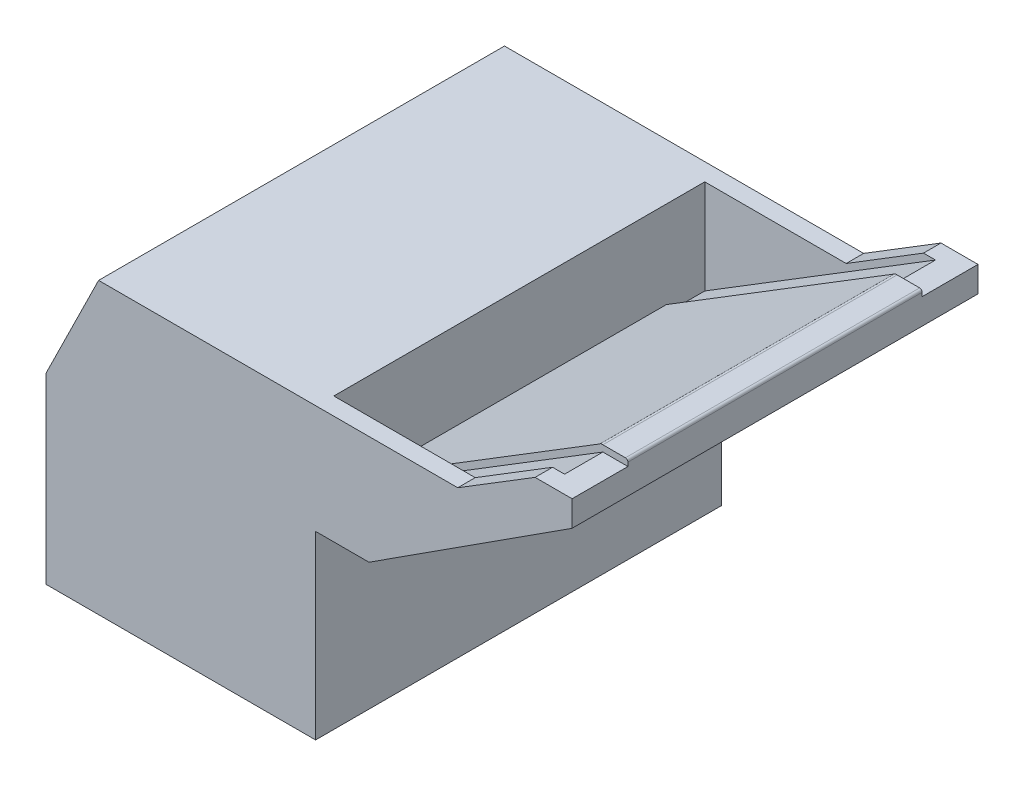
ISO-10303-21;
HEADER;
FILE_DESCRIPTION(('STEP AP214'),'2;1');
FILE_NAME('part.step','',(''),(''),'','','');
FILE_SCHEMA(('AUTOMOTIVE_DESIGN { 1 0 10303 214 1 1 1 1 }'));
ENDSEC;
DATA;
#1=APPLICATION_CONTEXT('core data for automotive mechanical design processes');
#2=APPLICATION_PROTOCOL_DEFINITION('international standard','automotive_design',2000,#1);
#3=PRODUCT_CONTEXT('',#1,'mechanical');
#4=PRODUCT('Part','Part','',(#3));
#5=PRODUCT_RELATED_PRODUCT_CATEGORY('part','',(#4));
#6=PRODUCT_DEFINITION_FORMATION('','',#4);
#7=PRODUCT_DEFINITION_CONTEXT('part definition',#1,'design');
#8=PRODUCT_DEFINITION('design','',#6,#7);
#9=PRODUCT_DEFINITION_SHAPE('','',#8);
#10=(LENGTH_UNIT() NAMED_UNIT(*) SI_UNIT(.MILLI.,.METRE.));
#11=(NAMED_UNIT(*) PLANE_ANGLE_UNIT() SI_UNIT($,.RADIAN.));
#12=(NAMED_UNIT(*) SI_UNIT($,.STERADIAN.) SOLID_ANGLE_UNIT());
#13=UNCERTAINTY_MEASURE_WITH_UNIT(LENGTH_MEASURE(1.E-05),#10,'distance_accuracy_value','');
#14=(GEOMETRIC_REPRESENTATION_CONTEXT(3) GLOBAL_UNCERTAINTY_ASSIGNED_CONTEXT((#13)) GLOBAL_UNIT_ASSIGNED_CONTEXT((#10,
#11,#12)) REPRESENTATION_CONTEXT('',''));
#15=CARTESIAN_POINT('',(0.,0.,0.));
#16=DIRECTION('',(0.,0.,1.));
#17=DIRECTION('',(1.,0.,0.));
#18=AXIS2_PLACEMENT_3D('',#15,#16,#17);
#19=CARTESIAN_POINT('',(3482.83314332459,2711.39867328876,3050.));
#20=DIRECTION('',(0.,-1.,0.));
#21=DIRECTION('',(0.,0.,-1.));
#22=AXIS2_PLACEMENT_3D('',#19,#20,#21);
#23=PLANE('',#22);
#24=DIRECTION('',(1.,0.,0.));
#25=VECTOR('',#24,1.);
#26=CARTESIAN_POINT('',(3777.24823772892,2711.39867328876,2695.));
#27=LINE('',#26,#25);
#28=CARTESIAN_POINT('',(3578.15595954075,2711.39867328876,2695.));
#29=VERTEX_POINT('',#28);
#30=CARTESIAN_POINT('',(3777.24823772892,2711.39867328876,2695.));
#31=VERTEX_POINT('',#30);
#32=EDGE_CURVE('E196',#29,#31,#27,.T.);
#33=ORIENTED_EDGE('',*,*,#32,.F.);
#34=DIRECTION('',(0.,0.,1.));
#35=VECTOR('',#34,1.);
#36=CARTESIAN_POINT('',(3578.15595954075,2711.39867328876,49.9999999999998));
#37=LINE('',#36,#35);
#38=CARTESIAN_POINT('',(3578.15595954075,2711.39867328876,3000.));
#39=VERTEX_POINT('',#38);
#40=EDGE_CURVE('E254',#29,#39,#37,.T.);
#41=ORIENTED_EDGE('',*,*,#40,.T.);
#42=DIRECTION('',(-1.,0.,0.));
#43=VECTOR('',#42,1.);
#44=CARTESIAN_POINT('',(3482.83314332459,2711.39867328876,3000.));
#45=LINE('',#44,#43);
#46=CARTESIAN_POINT('',(3482.83314332459,2711.39867328876,3000.));
#47=VERTEX_POINT('',#46);
#48=EDGE_CURVE('E245',#39,#47,#45,.T.);
#49=ORIENTED_EDGE('',*,*,#48,.T.);
#50=DIRECTION('',(0.,0.,-1.));
#51=VECTOR('',#50,1.);
#52=CARTESIAN_POINT('',(3482.83314332459,2711.39867328876,3050.));
#53=LINE('',#52,#51);
#54=CARTESIAN_POINT('',(3482.83314332459,2711.39867328876,3139.));
#55=VERTEX_POINT('',#54);
#56=EDGE_CURVE('E273',#55,#47,#53,.T.);
#57=ORIENTED_EDGE('',*,*,#56,.F.);
#58=DIRECTION('',(-1.,0.,0.));
#59=VECTOR('',#58,1.);
#60=CARTESIAN_POINT('',(3482.83314332459,2711.39867328876,3139.));
#61=LINE('',#60,#59);
#62=CARTESIAN_POINT('',(3777.24823772892,2711.39867328876,3139.));
#63=VERTEX_POINT('',#62);
#64=EDGE_CURVE('E328',#63,#55,#61,.T.);
#65=ORIENTED_EDGE('',*,*,#64,.F.);
#66=DIRECTION('',(0.,0.,-1.));
#67=VECTOR('',#66,1.);
#68=CARTESIAN_POINT('',(3777.24823772892,2711.39867328876,3050.));
#69=LINE('',#68,#67);
#70=EDGE_CURVE('E277',#63,#31,#69,.T.);
#71=ORIENTED_EDGE('',*,*,#70,.T.);
#72=EDGE_LOOP('',(#33,#41,#49,#57,#65,#71));
#73=FACE_BOUND('',#72,.T.);
#74=ADVANCED_FACE('F35',(#73),#23,.F.);
#75=DIRECTION('',(-1.,0.,0.));
#76=VECTOR('',#75,1.);
#77=CARTESIAN_POINT('',(3578.15595954075,2711.39867328876,355.));
#78=LINE('',#77,#76);
#79=CARTESIAN_POINT('',(3777.24823772892,2711.39867328876,355.));
#80=VERTEX_POINT('',#79);
#81=CARTESIAN_POINT('',(3578.15595954075,2711.39867328876,355.));
#82=VERTEX_POINT('',#81);
#83=EDGE_CURVE('E313',#80,#82,#78,.T.);
#84=ORIENTED_EDGE('',*,*,#83,.F.);
#85=CARTESIAN_POINT('',(3777.24823772892,2711.39867328876,-89.));
#86=VERTEX_POINT('',#85);
#87=EDGE_CURVE('E276',#80,#86,#69,.T.);
#88=ORIENTED_EDGE('',*,*,#87,.T.);
#89=DIRECTION('',(-1.,0.,0.));
#90=VECTOR('',#89,1.);
#91=CARTESIAN_POINT('',(3482.83314332459,2711.39867328876,-89.));
#92=LINE('',#91,#90);
#93=CARTESIAN_POINT('',(3482.83314332459,2711.39867328876,-89.));
#94=VERTEX_POINT('',#93);
#95=EDGE_CURVE('E358',#86,#94,#92,.T.);
#96=ORIENTED_EDGE('',*,*,#95,.T.);
#97=CARTESIAN_POINT('',(3482.83314332459,2711.39867328876,49.9999999999998));
#98=VERTEX_POINT('',#97);
#99=EDGE_CURVE('E272',#98,#94,#53,.T.);
#100=ORIENTED_EDGE('',*,*,#99,.F.);
#101=DIRECTION('',(-1.,0.,0.));
#102=VECTOR('',#101,1.);
#103=CARTESIAN_POINT('',(3482.83314332459,2711.39867328876,49.9999999999998));
#104=LINE('',#103,#102);
#105=CARTESIAN_POINT('',(3578.15595954075,2711.39867328876,49.9999999999998));
#106=VERTEX_POINT('',#105);
#107=EDGE_CURVE('E235',#106,#98,#104,.T.);
#108=ORIENTED_EDGE('',*,*,#107,.F.);
#109=EDGE_CURVE('E250',#106,#82,#37,.T.);
#110=ORIENTED_EDGE('',*,*,#109,.T.);
#111=EDGE_LOOP('',(#84,#88,#96,#100,#108,#110));
#112=FACE_BOUND('',#111,.T.);
#113=ADVANCED_FACE('F429',(#112),#23,.F.);
#114=CARTESIAN_POINT('',(3578.15595954075,2711.39867328876,49.9999999999998));
#115=DIRECTION('',(0.524533390690194,-0.851389876643508,0.));
#116=DIRECTION('',(0.851389876643508,0.524533390690194,0.));
#117=AXIS2_PLACEMENT_3D('',#114,#115,#116);
#118=PLANE('',#117);
#119=DIRECTION('',(0.851389876643508,0.524533390690194,0.));
#120=VECTOR('',#119,1.);
#121=CARTESIAN_POINT('',(3578.15595954075,2711.39867328876,2695.));
#122=LINE('',#121,#120);
#123=CARTESIAN_POINT('',(1743.28076952474,1580.94912095586,2695.));
#124=VERTEX_POINT('',#123);
#125=EDGE_CURVE('E220',#124,#29,#122,.T.);
#126=ORIENTED_EDGE('',*,*,#125,.F.);
#127=DIRECTION('',(0.,0.,1.));
#128=VECTOR('',#127,1.);
#129=CARTESIAN_POINT('',(1743.28076952474,1580.94912095586,49.9999999999998));
#130=LINE('',#129,#128);
#131=CARTESIAN_POINT('',(1743.28076952474,1580.94912095586,3000.));
#132=VERTEX_POINT('',#131);
#133=EDGE_CURVE('E258',#124,#132,#130,.T.);
#134=ORIENTED_EDGE('',*,*,#133,.T.);
#135=DIRECTION('',(0.851389876643508,0.524533390690194,0.));
#136=VECTOR('',#135,1.);
#137=CARTESIAN_POINT('',(3578.15595954075,2711.39867328876,3000.));
#138=LINE('',#137,#136);
#139=EDGE_CURVE('E242',#132,#39,#138,.T.);
#140=ORIENTED_EDGE('',*,*,#139,.T.);
#141=ORIENTED_EDGE('',*,*,#40,.F.);
#142=EDGE_LOOP('',(#126,#134,#140,#141));
#143=FACE_BOUND('',#142,.T.);
#144=ADVANCED_FACE('F434',(#143),#118,.F.);
#145=DIRECTION('',(-0.851389876643508,-0.524533390690194,0.));
#146=VECTOR('',#145,1.);
#147=CARTESIAN_POINT('',(2078.91946779851,1787.7330037364,355.));
#148=LINE('',#147,#146);
#149=CARTESIAN_POINT('',(1743.28076952474,1580.94912095586,355.));
#150=VERTEX_POINT('',#149);
#151=EDGE_CURVE('E208',#82,#150,#148,.T.);
#152=ORIENTED_EDGE('',*,*,#151,.F.);
#153=ORIENTED_EDGE('',*,*,#109,.F.);
#154=DIRECTION('',(0.851389876643508,0.524533390690194,0.));
#155=VECTOR('',#154,1.);
#156=CARTESIAN_POINT('',(3578.15595954075,2711.39867328876,49.9999999999998));
#157=LINE('',#156,#155);
#158=CARTESIAN_POINT('',(1743.28076952474,1580.94912095586,49.9999999999998));
#159=VERTEX_POINT('',#158);
#160=EDGE_CURVE('E232',#159,#106,#157,.T.);
#161=ORIENTED_EDGE('',*,*,#160,.F.);
#162=EDGE_CURVE('E255',#159,#150,#130,.T.);
#163=ORIENTED_EDGE('',*,*,#162,.T.);
#164=EDGE_LOOP('',(#152,#153,#161,#163));
#165=FACE_BOUND('',#164,.T.);
#166=ADVANCED_FACE('F457',(#165),#118,.F.);
#167=CARTESIAN_POINT('',(1743.28076952474,1580.94912095586,49.9999999999998));
#168=DIRECTION('',(-1.,0.,0.));
#169=DIRECTION('',(0.,0.,1.));
#170=AXIS2_PLACEMENT_3D('',#167,#168,#169);
#171=PLANE('',#170);
#172=DIRECTION('',(0.,-1.,0.));
#173=VECTOR('',#172,1.);
#174=CARTESIAN_POINT('',(1743.28076952474,1580.94912095586,2695.));
#175=LINE('',#174,#173);
#176=CARTESIAN_POINT('',(1743.28076952474,1639.67662215322,2695.));
#177=VERTEX_POINT('',#176);
#178=EDGE_CURVE('E289',#177,#124,#175,.T.);
#179=ORIENTED_EDGE('',*,*,#178,.F.);
#180=DIRECTION('',(0.,0.,1.));
#181=VECTOR('',#180,1.);
#182=CARTESIAN_POINT('',(1743.28076952474,1639.67662215322,49.9999999999998));
#183=LINE('',#182,#181);
#184=CARTESIAN_POINT('',(1743.28076952474,1639.67662215322,355.));
#185=VERTEX_POINT('',#184);
#186=EDGE_CURVE('E286',#185,#177,#183,.T.);
#187=ORIENTED_EDGE('',*,*,#186,.F.);
#188=DIRECTION('',(0.,1.,0.));
#189=VECTOR('',#188,1.);
#190=CARTESIAN_POINT('',(1743.28076952474,1580.94912095586,355.));
#191=LINE('',#190,#189);
#192=EDGE_CURVE('E204',#150,#185,#191,.T.);
#193=ORIENTED_EDGE('',*,*,#192,.F.);
#194=ORIENTED_EDGE('',*,*,#162,.F.);
#195=DIRECTION('',(0.,-1.,0.));
#196=VECTOR('',#195,1.);
#197=CARTESIAN_POINT('',(1743.28076952474,1580.94912095586,49.9999999999998));
#198=LINE('',#197,#196);
#199=CARTESIAN_POINT('',(1743.28076952474,2332.52079988428,49.9999999999998));
#200=VERTEX_POINT('',#199);
#201=EDGE_CURVE('E228',#200,#159,#198,.T.);
#202=ORIENTED_EDGE('',*,*,#201,.F.);
#203=DIRECTION('',(0.,0.,1.));
#204=VECTOR('',#203,1.);
#205=CARTESIAN_POINT('',(1743.28076952474,2332.52079988428,49.9999999999998));
#206=LINE('',#205,#204);
#207=CARTESIAN_POINT('',(1743.28076952474,2332.52079988428,3000.));
#208=VERTEX_POINT('',#207);
#209=EDGE_CURVE('E238',#200,#208,#206,.T.);
#210=ORIENTED_EDGE('',*,*,#209,.T.);
#211=DIRECTION('',(0.,-1.,0.));
#212=VECTOR('',#211,1.);
#213=CARTESIAN_POINT('',(1743.28076952474,1580.94912095586,3000.));
#214=LINE('',#213,#212);
#215=EDGE_CURVE('E216',#208,#132,#214,.T.);
#216=ORIENTED_EDGE('',*,*,#215,.T.);
#217=ORIENTED_EDGE('',*,*,#133,.F.);
#218=EDGE_LOOP('',(#179,#187,#193,#194,#202,#210,#216,#217));
#219=FACE_BOUND('',#218,.T.);
#220=ADVANCED_FACE('F452',(#219),#171,.F.);
#221=CARTESIAN_POINT('',(2867.86221558949,2332.52079988428,3050.));
#222=DIRECTION('',(0.524533390690194,-0.851389876643508,0.));
#223=DIRECTION('',(0.851389876643508,0.524533390690194,0.));
#224=AXIS2_PLACEMENT_3D('',#221,#222,#223);
#225=PLANE('',#224);
#226=DIRECTION('',(-0.851389876643508,-0.524533390690194,0.));
#227=VECTOR('',#226,1.);
#228=CARTESIAN_POINT('',(2867.86221558949,2332.52079988428,49.9999999999998));
#229=LINE('',#228,#227);
#230=CARTESIAN_POINT('',(2867.86221558949,2332.52079988428,49.9999999999998));
#231=VERTEX_POINT('',#230);
#232=EDGE_CURVE('E237',#98,#231,#229,.T.);
#233=ORIENTED_EDGE('',*,*,#232,.F.);
#234=ORIENTED_EDGE('',*,*,#99,.T.);
#235=DIRECTION('',(-0.851389876643508,-0.524533390690194,0.));
#236=VECTOR('',#235,1.);
#237=CARTESIAN_POINT('',(2867.86221558949,2332.52079988428,-89.));
#238=LINE('',#237,#236);
#239=CARTESIAN_POINT('',(2867.86221558949,2332.52079988428,-89.));
#240=VERTEX_POINT('',#239);
#241=EDGE_CURVE('E361',#94,#240,#238,.T.);
#242=ORIENTED_EDGE('',*,*,#241,.T.);
#243=DIRECTION('',(0.,0.,-1.));
#244=VECTOR('',#243,1.);
#245=CARTESIAN_POINT('',(2867.86221558949,2332.52079988428,3050.));
#246=LINE('',#245,#244);
#247=EDGE_CURVE('E268',#231,#240,#246,.T.);
#248=ORIENTED_EDGE('',*,*,#247,.F.);
#249=EDGE_LOOP('',(#233,#234,#242,#248));
#250=FACE_BOUND('',#249,.T.);
#251=ADVANCED_FACE('F448',(#250),#225,.F.);
#252=CARTESIAN_POINT('',(1755.88757903934,2332.52079988428,3050.));
#253=DIRECTION('',(0.,-1.,0.));
#254=DIRECTION('',(0.,0.,-1.));
#255=AXIS2_PLACEMENT_3D('',#252,#253,#254);
#256=PLANE('',#255);
#257=DIRECTION('',(-1.,0.,0.));
#258=VECTOR('',#257,1.);
#259=CARTESIAN_POINT('',(1743.28076952474,2332.52079988428,49.9999999999998));
#260=LINE('',#259,#258);
#261=EDGE_CURVE('E225',#231,#200,#260,.T.);
#262=ORIENTED_EDGE('',*,*,#261,.F.);
#263=ORIENTED_EDGE('',*,*,#247,.T.);
#264=DIRECTION('',(-1.,0.,0.));
#265=VECTOR('',#264,1.);
#266=CARTESIAN_POINT('',(1755.88757903934,2332.52079988428,-89.));
#267=LINE('',#266,#265);
#268=CARTESIAN_POINT('',(11.564226404423,2332.52079988428,-89.));
#269=VERTEX_POINT('',#268);
#270=EDGE_CURVE('E364',#240,#269,#267,.T.);
#271=ORIENTED_EDGE('',*,*,#270,.T.);
#272=DIRECTION('',(0.,0.,-1.));
#273=VECTOR('',#272,1.);
#274=CARTESIAN_POINT('',(11.564226404423,2332.52079988428,3050.));
#275=LINE('',#274,#273);
#276=CARTESIAN_POINT('',(11.564226404423,2332.52079988428,3139.));
#277=VERTEX_POINT('',#276);
#278=EDGE_CURVE('E266',#277,#269,#275,.T.);
#279=ORIENTED_EDGE('',*,*,#278,.F.);
#280=DIRECTION('',(-1.,0.,0.));
#281=VECTOR('',#280,1.);
#282=CARTESIAN_POINT('',(1755.88757903934,2332.52079988428,3139.));
#283=LINE('',#282,#281);
#284=CARTESIAN_POINT('',(2867.86221558949,2332.52079988428,3139.));
#285=VERTEX_POINT('',#284);
#286=EDGE_CURVE('E334',#285,#277,#283,.T.);
#287=ORIENTED_EDGE('',*,*,#286,.F.);
#288=CARTESIAN_POINT('',(2867.86221558949,2332.52079988428,3000.));
#289=VERTEX_POINT('',#288);
#290=EDGE_CURVE('E269',#285,#289,#246,.T.);
#291=ORIENTED_EDGE('',*,*,#290,.T.);
#292=DIRECTION('',(-1.,0.,0.));
#293=VECTOR('',#292,1.);
#294=CARTESIAN_POINT('',(1743.28076952474,2332.52079988428,3000.));
#295=LINE('',#294,#293);
#296=EDGE_CURVE('E213',#289,#208,#295,.T.);
#297=ORIENTED_EDGE('',*,*,#296,.T.);
#298=ORIENTED_EDGE('',*,*,#209,.F.);
#299=EDGE_LOOP('',(#262,#263,#271,#279,#287,#291,#297,#298));
#300=FACE_BOUND('',#299,.T.);
#301=ADVANCED_FACE('F412',(#300),#256,.F.);
#302=CARTESIAN_POINT('',(1737.34593797706,48.7126598758875,3050.));
#303=DIRECTION('',(-1.,0.,0.));
#304=DIRECTION('',(0.,0.,1.));
#305=AXIS2_PLACEMENT_3D('',#302,#303,#304);
#306=PLANE('',#305);
#307=DIRECTION('',(0.,0.,-1.));
#308=VECTOR('',#307,1.);
#309=CARTESIAN_POINT('',(1737.34593797706,29.9175918173588,3050.));
#310=LINE('',#309,#308);
#311=CARTESIAN_POINT('',(1737.34593797706,29.9175918173588,3139.));
#312=VERTEX_POINT('',#311);
#313=CARTESIAN_POINT('',(1737.34593797706,29.9175918173588,-89.));
#314=VERTEX_POINT('',#313);
#315=EDGE_CURVE('E253',#312,#314,#310,.T.);
#316=ORIENTED_EDGE('',*,*,#315,.T.);
#317=DIRECTION('',(0.,1.,0.));
#318=VECTOR('',#317,1.);
#319=CARTESIAN_POINT('',(1737.34593797706,29.9175918173588,-89.));
#320=LINE('',#319,#318);
#321=CARTESIAN_POINT('',(1737.34593797706,1466.57858203514,-89.));
#322=VERTEX_POINT('',#321);
#323=EDGE_CURVE('E346',#314,#322,#320,.T.);
#324=ORIENTED_EDGE('',*,*,#323,.T.);
#325=DIRECTION('',(0.,0.,-1.));
#326=VECTOR('',#325,1.);
#327=CARTESIAN_POINT('',(1737.34593797706,1466.57858203514,3050.));
#328=LINE('',#327,#326);
#329=CARTESIAN_POINT('',(1737.34593797706,1466.57858203514,3139.));
#330=VERTEX_POINT('',#329);
#331=EDGE_CURVE('E284',#330,#322,#328,.T.);
#332=ORIENTED_EDGE('',*,*,#331,.F.);
#333=DIRECTION('',(0.,1.,0.));
#334=VECTOR('',#333,1.);
#335=CARTESIAN_POINT('',(1737.34593797706,29.9175918173588,3139.));
#336=LINE('',#335,#334);
#337=EDGE_CURVE('E316',#312,#330,#336,.T.);
#338=ORIENTED_EDGE('',*,*,#337,.F.);
#339=EDGE_LOOP('',(#316,#324,#332,#338));
#340=FACE_BOUND('',#339,.T.);
#341=ADVANCED_FACE('F386',(#340),#306,.F.);
#342=CARTESIAN_POINT('',(2162.0532089371,1466.57858203514,3050.));
#343=DIRECTION('',(0.,1.,0.));
#344=DIRECTION('',(0.,0.,1.));
#345=AXIS2_PLACEMENT_3D('',#342,#343,#344);
#346=PLANE('',#345);
#347=ORIENTED_EDGE('',*,*,#331,.T.);
#348=DIRECTION('',(1.,0.,0.));
#349=VECTOR('',#348,1.);
#350=CARTESIAN_POINT('',(2162.0532089371,1466.57858203514,-89.));
#351=LINE('',#350,#349);
#352=CARTESIAN_POINT('',(2162.0532089371,1466.57858203514,-89.));
#353=VERTEX_POINT('',#352);
#354=EDGE_CURVE('E349',#322,#353,#351,.T.);
#355=ORIENTED_EDGE('',*,*,#354,.T.);
#356=DIRECTION('',(0.,0.,-1.));
#357=VECTOR('',#356,1.);
#358=CARTESIAN_POINT('',(2162.0532089371,1466.57858203514,3050.));
#359=LINE('',#358,#357);
#360=CARTESIAN_POINT('',(2162.0532089371,1466.57858203514,3139.));
#361=VERTEX_POINT('',#360);
#362=EDGE_CURVE('E282',#361,#353,#359,.T.);
#363=ORIENTED_EDGE('',*,*,#362,.F.);
#364=DIRECTION('',(1.,0.,0.));
#365=VECTOR('',#364,1.);
#366=CARTESIAN_POINT('',(2162.0532089371,1466.57858203514,3139.));
#367=LINE('',#366,#365);
#368=EDGE_CURVE('E319',#330,#361,#367,.T.);
#369=ORIENTED_EDGE('',*,*,#368,.F.);
#370=EDGE_LOOP('',(#347,#355,#363,#369));
#371=FACE_BOUND('',#370,.T.);
#372=ADVANCED_FACE('F393',(#371),#346,.F.);
#373=CARTESIAN_POINT('',(3777.24823772892,2507.94563345983,3050.));
#374=DIRECTION('',(-0.541871763606932,0.840461178047811,0.));
#375=DIRECTION('',(-0.840461178047811,-0.541871763606932,0.));
#376=AXIS2_PLACEMENT_3D('',#373,#374,#375);
#377=PLANE('',#376);
#378=ORIENTED_EDGE('',*,*,#362,.T.);
#379=DIRECTION('',(0.840461178047811,0.541871763606932,0.));
#380=VECTOR('',#379,1.);
#381=CARTESIAN_POINT('',(3777.24823772892,2507.94563345983,-89.));
#382=LINE('',#381,#380);
#383=CARTESIAN_POINT('',(3777.24823772892,2507.94563345983,-89.));
#384=VERTEX_POINT('',#383);
#385=EDGE_CURVE('E352',#353,#384,#382,.T.);
#386=ORIENTED_EDGE('',*,*,#385,.T.);
#387=DIRECTION('',(0.,0.,-1.));
#388=VECTOR('',#387,1.);
#389=CARTESIAN_POINT('',(3777.24823772892,2507.94563345983,3050.));
#390=LINE('',#389,#388);
#391=CARTESIAN_POINT('',(3777.24823772892,2507.94563345983,3139.));
#392=VERTEX_POINT('',#391);
#393=EDGE_CURVE('E280',#392,#384,#390,.T.);
#394=ORIENTED_EDGE('',*,*,#393,.F.);
#395=DIRECTION('',(0.840461178047811,0.541871763606932,0.));
#396=VECTOR('',#395,1.);
#397=CARTESIAN_POINT('',(3777.24823772892,2507.94563345983,3139.));
#398=LINE('',#397,#396);
#399=EDGE_CURVE('E322',#361,#392,#398,.T.);
#400=ORIENTED_EDGE('',*,*,#399,.F.);
#401=EDGE_LOOP('',(#378,#386,#394,#400));
#402=FACE_BOUND('',#401,.T.);
#403=ADVANCED_FACE('F395',(#402),#377,.F.);
#404=CARTESIAN_POINT('',(3777.24823772892,2711.39867328876,3050.));
#405=DIRECTION('',(-1.,0.,0.));
#406=DIRECTION('',(0.,0.,1.));
#407=AXIS2_PLACEMENT_3D('',#404,#405,#406);
#408=PLANE('',#407);
#409=DIRECTION('',(0.,-1.,0.));
#410=VECTOR('',#409,1.);
#411=CARTESIAN_POINT('',(3777.24823772892,2761.39867328876,355.));
#412=LINE('',#411,#410);
#413=CARTESIAN_POINT('',(3777.24823772892,2741.39867328876,355.));
#414=VERTEX_POINT('',#413);
#415=EDGE_CURVE('E304',#414,#80,#412,.T.);
#416=ORIENTED_EDGE('',*,*,#415,.F.);
#417=DIRECTION('',(0.,0.,-1.));
#418=VECTOR('',#417,1.);
#419=CARTESIAN_POINT('',(3777.24823772892,2741.39867328876,3050.));
#420=LINE('',#419,#418);
#421=CARTESIAN_POINT('',(3777.24823772892,2741.39867328876,2695.));
#422=VERTEX_POINT('',#421);
#423=EDGE_CURVE('E43',#414,#422,#420,.F.);
#424=ORIENTED_EDGE('',*,*,#423,.T.);
#425=DIRECTION('',(0.,-1.,0.));
#426=VECTOR('',#425,1.);
#427=CARTESIAN_POINT('',(3777.24823772892,2761.39867328876,2695.));
#428=LINE('',#427,#426);
#429=EDGE_CURVE('E306',#422,#31,#428,.T.);
#430=ORIENTED_EDGE('',*,*,#429,.T.);
#431=ORIENTED_EDGE('',*,*,#70,.F.);
#432=DIRECTION('',(0.,1.,0.));
#433=VECTOR('',#432,1.);
#434=CARTESIAN_POINT('',(3777.24823772892,2711.39867328876,3139.));
#435=LINE('',#434,#433);
#436=EDGE_CURVE('E325',#392,#63,#435,.T.);
#437=ORIENTED_EDGE('',*,*,#436,.F.);
#438=ORIENTED_EDGE('',*,*,#393,.T.);
#439=DIRECTION('',(0.,1.,0.));
#440=VECTOR('',#439,1.);
#441=CARTESIAN_POINT('',(3777.24823772892,2711.39867328876,-89.));
#442=LINE('',#441,#440);
#443=EDGE_CURVE('E355',#384,#86,#442,.T.);
#444=ORIENTED_EDGE('',*,*,#443,.T.);
#445=ORIENTED_EDGE('',*,*,#87,.F.);
#446=EDGE_LOOP('',(#416,#424,#430,#431,#437,#438,#444,#445));
#447=FACE_BOUND('',#446,.T.);
#448=ADVANCED_FACE('F400',(#447),#408,.F.);
#449=ORIENTED_EDGE('',*,*,#56,.T.);
#450=DIRECTION('',(-0.851389876643508,-0.524533390690194,0.));
#451=VECTOR('',#450,1.);
#452=CARTESIAN_POINT('',(2867.86221558949,2332.52079988428,3000.));
#453=LINE('',#452,#451);
#454=EDGE_CURVE('E229',#47,#289,#453,.T.);
#455=ORIENTED_EDGE('',*,*,#454,.T.);
#456=ORIENTED_EDGE('',*,*,#290,.F.);
#457=DIRECTION('',(-0.851389876643508,-0.524533390690194,0.));
#458=VECTOR('',#457,1.);
#459=CARTESIAN_POINT('',(2867.86221558949,2332.52079988428,3139.));
#460=LINE('',#459,#458);
#461=EDGE_CURVE('E331',#55,#285,#460,.T.);
#462=ORIENTED_EDGE('',*,*,#461,.F.);
#463=EDGE_LOOP('',(#449,#455,#456,#462));
#464=FACE_BOUND('',#463,.T.);
#465=ADVANCED_FACE('F407',(#464),#225,.F.);
#466=CARTESIAN_POINT('',(11.564226404423,2332.52079988428,3050.));
#467=DIRECTION('',(0.896935607403481,-0.44216118799794,0.));
#468=DIRECTION('',(0.44216118799794,0.89693560740348,0.));
#469=AXIS2_PLACEMENT_3D('',#466,#467,#468);
#470=PLANE('',#469);
#471=ORIENTED_EDGE('',*,*,#278,.T.);
#472=DIRECTION('',(-0.44216118799794,-0.89693560740348,0.));
#473=VECTOR('',#472,1.);
#474=CARTESIAN_POINT('',(11.564226404423,2332.52079988428,-89.));
#475=LINE('',#474,#473);
#476=CARTESIAN_POINT('',(-406.75770254557,1483.9437569017,-89.));
#477=VERTEX_POINT('',#476);
#478=EDGE_CURVE('E367',#269,#477,#475,.T.);
#479=ORIENTED_EDGE('',*,*,#478,.T.);
#480=DIRECTION('',(0.,0.,-1.));
#481=VECTOR('',#480,1.);
#482=CARTESIAN_POINT('',(-406.75770254557,1483.9437569017,3050.));
#483=LINE('',#482,#481);
#484=CARTESIAN_POINT('',(-406.75770254557,1483.9437569017,3139.));
#485=VERTEX_POINT('',#484);
#486=EDGE_CURVE('E264',#485,#477,#483,.T.);
#487=ORIENTED_EDGE('',*,*,#486,.F.);
#488=DIRECTION('',(-0.44216118799794,-0.89693560740348,0.));
#489=VECTOR('',#488,1.);
#490=CARTESIAN_POINT('',(11.564226404423,2332.52079988428,3139.));
#491=LINE('',#490,#489);
#492=EDGE_CURVE('E337',#277,#485,#491,.T.);
#493=ORIENTED_EDGE('',*,*,#492,.F.);
#494=EDGE_LOOP('',(#471,#479,#487,#493));
#495=FACE_BOUND('',#494,.T.);
#496=ADVANCED_FACE('F415',(#495),#470,.F.);
#497=CARTESIAN_POINT('',(-406.75770254557,1483.9437569017,3050.));
#498=DIRECTION('',(1.,0.,0.));
#499=DIRECTION('',(0.,0.,-1.));
#500=AXIS2_PLACEMENT_3D('',#497,#498,#499);
#501=PLANE('',#500);
#502=ORIENTED_EDGE('',*,*,#486,.T.);
#503=DIRECTION('',(0.,-1.,0.));
#504=VECTOR('',#503,1.);
#505=CARTESIAN_POINT('',(-406.75770254557,1483.9437569017,-89.));
#506=LINE('',#505,#504);
#507=CARTESIAN_POINT('',(-406.75770254557,29.9175918173588,-89.));
#508=VERTEX_POINT('',#507);
#509=EDGE_CURVE('E370',#477,#508,#506,.T.);
#510=ORIENTED_EDGE('',*,*,#509,.T.);
#511=DIRECTION('',(0.,0.,-1.));
#512=VECTOR('',#511,1.);
#513=CARTESIAN_POINT('',(-406.75770254557,29.9175918173588,3050.));
#514=LINE('',#513,#512);
#515=CARTESIAN_POINT('',(-406.75770254557,29.9175918173588,3139.));
#516=VERTEX_POINT('',#515);
#517=EDGE_CURVE('E262',#516,#508,#514,.T.);
#518=ORIENTED_EDGE('',*,*,#517,.F.);
#519=DIRECTION('',(0.,-1.,0.));
#520=VECTOR('',#519,1.);
#521=CARTESIAN_POINT('',(-406.75770254557,1483.9437569017,3139.));
#522=LINE('',#521,#520);
#523=EDGE_CURVE('E340',#485,#516,#522,.T.);
#524=ORIENTED_EDGE('',*,*,#523,.F.);
#525=EDGE_LOOP('',(#502,#510,#518,#524));
#526=FACE_BOUND('',#525,.T.);
#527=ADVANCED_FACE('F418',(#526),#501,.F.);
#528=CARTESIAN_POINT('',(-406.75770254557,29.9175918173588,3050.));
#529=DIRECTION('',(0.,1.,0.));
#530=DIRECTION('',(0.,0.,1.));
#531=AXIS2_PLACEMENT_3D('',#528,#529,#530);
#532=PLANE('',#531);
#533=ORIENTED_EDGE('',*,*,#517,.T.);
#534=DIRECTION('',(1.,0.,0.));
#535=VECTOR('',#534,1.);
#536=CARTESIAN_POINT('',(-406.75770254557,29.9175918173588,-89.));
#537=LINE('',#536,#535);
#538=EDGE_CURVE('E223',#508,#314,#537,.T.);
#539=ORIENTED_EDGE('',*,*,#538,.T.);
#540=ORIENTED_EDGE('',*,*,#315,.F.);
#541=DIRECTION('',(1.,0.,0.));
#542=VECTOR('',#541,1.);
#543=CARTESIAN_POINT('',(-406.75770254557,29.9175918173588,3139.));
#544=LINE('',#543,#542);
#545=EDGE_CURVE('E343',#516,#312,#544,.T.);
#546=ORIENTED_EDGE('',*,*,#545,.F.);
#547=EDGE_LOOP('',(#533,#539,#540,#546));
#548=FACE_BOUND('',#547,.T.);
#549=ADVANCED_FACE('F376',(#548),#532,.F.);
#550=CARTESIAN_POINT('',(0.,0.,49.9999999999998));
#551=DIRECTION('',(0.,0.,1.));
#552=DIRECTION('',(1.,0.,0.));
#553=AXIS2_PLACEMENT_3D('',#550,#551,#552);
#554=PLANE('',#553);
#555=ORIENTED_EDGE('',*,*,#261,.T.);
#556=ORIENTED_EDGE('',*,*,#201,.T.);
#557=ORIENTED_EDGE('',*,*,#160,.T.);
#558=ORIENTED_EDGE('',*,*,#107,.T.);
#559=ORIENTED_EDGE('',*,*,#232,.T.);
#560=EDGE_LOOP('',(#555,#556,#557,#558,#559));
#561=FACE_BOUND('',#560,.T.);
#562=ADVANCED_FACE('F425',(#561),#554,.T.);
#563=CARTESIAN_POINT('',(0.,0.,3000.));
#564=DIRECTION('',(0.,0.,1.));
#565=DIRECTION('',(1.,0.,0.));
#566=AXIS2_PLACEMENT_3D('',#563,#564,#565);
#567=PLANE('',#566);
#568=ORIENTED_EDGE('',*,*,#296,.F.);
#569=ORIENTED_EDGE('',*,*,#454,.F.);
#570=ORIENTED_EDGE('',*,*,#48,.F.);
#571=ORIENTED_EDGE('',*,*,#139,.F.);
#572=ORIENTED_EDGE('',*,*,#215,.F.);
#573=EDGE_LOOP('',(#568,#569,#570,#571,#572));
#574=FACE_BOUND('',#573,.T.);
#575=ADVANCED_FACE('F572',(#574),#567,.F.);
#576=CARTESIAN_POINT('',(3551.92929000624,2753.96816712093,2695.));
#577=DIRECTION('',(0.,0.,-1.));
#578=DIRECTION('',(-1.,0.,0.));
#579=AXIS2_PLACEMENT_3D('',#576,#577,#578);
#580=PLANE('',#579);
#581=ORIENTED_EDGE('',*,*,#429,.F.);
#582=CARTESIAN_POINT('',(3757.24823772892,2741.39867328876,2695.));
#583=DIRECTION('',(0.,0.,-1.));
#584=DIRECTION('',(-1.,0.,0.));
#585=AXIS2_PLACEMENT_3D('',#582,#583,#584);
#586=CIRCLE('',#585,20.);
#587=CARTESIAN_POINT('',(3757.24823772892,2761.39867328876,2695.));
#588=VERTEX_POINT('',#587);
#589=EDGE_CURVE('E11',#422,#588,#586,.F.);
#590=ORIENTED_EDGE('',*,*,#589,.T.);
#591=DIRECTION('',(1.,0.,0.));
#592=VECTOR('',#591,1.);
#593=CARTESIAN_POINT('',(3777.24823772892,2761.39867328876,2695.));
#594=LINE('',#593,#592);
#595=CARTESIAN_POINT('',(3578.15595954075,2761.39867328876,2695.));
#596=VERTEX_POINT('',#595);
#597=EDGE_CURVE('E301',#596,#588,#594,.T.);
#598=ORIENTED_EDGE('',*,*,#597,.F.);
#599=CARTESIAN_POINT('',(3571.07299180246,2736.39867328876,2695.));
#600=DIRECTION('',(0.,0.,1.));
#601=DIRECTION('',(1.,0.,0.));
#602=AXIS2_PLACEMENT_3D('',#599,#600,#601);
#603=CIRCLE('',#602,25.9840033863451);
#604=CARTESIAN_POINT('',(3551.92929000624,2753.96816712093,2695.));
#605=VERTEX_POINT('',#604);
#606=EDGE_CURVE('E197',#596,#605,#603,.T.);
#607=ORIENTED_EDGE('',*,*,#606,.T.);
#608=DIRECTION('',(0.851389876643508,0.524533390690195,0.));
#609=VECTOR('',#608,1.);
#610=CARTESIAN_POINT('',(2052.692798264,1830.30249756857,2695.));
#611=LINE('',#610,#609);
#612=EDGE_CURVE('E207',#177,#605,#611,.T.);
#613=ORIENTED_EDGE('',*,*,#612,.F.);
#614=ORIENTED_EDGE('',*,*,#178,.T.);
#615=ORIENTED_EDGE('',*,*,#125,.T.);
#616=ORIENTED_EDGE('',*,*,#32,.T.);
#617=EDGE_LOOP('',(#581,#590,#598,#607,#613,#614,#615,#616));
#618=FACE_BOUND('',#617,.T.);
#619=ADVANCED_FACE('F566',(#618),#580,.F.);
#620=CARTESIAN_POINT('',(2052.692798264,1830.30249756857,355.));
#621=DIRECTION('',(0.,0.,1.));
#622=DIRECTION('',(1.,0.,0.));
#623=AXIS2_PLACEMENT_3D('',#620,#621,#622);
#624=PLANE('',#623);
#625=DIRECTION('',(-1.,0.,0.));
#626=VECTOR('',#625,1.);
#627=CARTESIAN_POINT('',(3578.15595954075,2761.39867328876,355.));
#628=LINE('',#627,#626);
#629=CARTESIAN_POINT('',(3757.24823772892,2761.39867328876,355.));
#630=VERTEX_POINT('',#629);
#631=CARTESIAN_POINT('',(3578.15595954075,2761.39867328876,355.));
#632=VERTEX_POINT('',#631);
#633=EDGE_CURVE('E299',#630,#632,#628,.T.);
#634=ORIENTED_EDGE('',*,*,#633,.F.);
#635=CARTESIAN_POINT('',(3757.24823772892,2741.39867328876,355.));
#636=DIRECTION('',(0.,0.,1.));
#637=DIRECTION('',(1.,0.,0.));
#638=AXIS2_PLACEMENT_3D('',#635,#636,#637);
#639=CIRCLE('',#638,20.);
#640=EDGE_CURVE('E57',#630,#414,#639,.F.);
#641=ORIENTED_EDGE('',*,*,#640,.T.);
#642=ORIENTED_EDGE('',*,*,#415,.T.);
#643=ORIENTED_EDGE('',*,*,#83,.T.);
#644=ORIENTED_EDGE('',*,*,#151,.T.);
#645=ORIENTED_EDGE('',*,*,#192,.T.);
#646=DIRECTION('',(-0.851389876643508,-0.524533390690195,0.));
#647=VECTOR('',#646,1.);
#648=CARTESIAN_POINT('',(1717.05409999023,1623.51861478804,355.));
#649=LINE('',#648,#647);
#650=CARTESIAN_POINT('',(3551.92929000624,2753.96816712093,355.));
#651=VERTEX_POINT('',#650);
#652=EDGE_CURVE('E201',#651,#185,#649,.T.);
#653=ORIENTED_EDGE('',*,*,#652,.F.);
#654=CARTESIAN_POINT('',(3571.07299180246,2736.39867328876,355.));
#655=DIRECTION('',(0.,0.,1.));
#656=DIRECTION('',(1.,0.,0.));
#657=AXIS2_PLACEMENT_3D('',#654,#655,#656);
#658=CIRCLE('',#657,25.9840033863451);
#659=EDGE_CURVE('E188',#632,#651,#658,.T.);
#660=ORIENTED_EDGE('',*,*,#659,.F.);
#661=EDGE_LOOP('',(#634,#641,#642,#643,#644,#645,#653,#660));
#662=FACE_BOUND('',#661,.T.);
#663=ADVANCED_FACE('F202',(#662),#624,.F.);
#664=CARTESIAN_POINT('',(-252.612712896753,410.025196277307,0.));
#665=DIRECTION('',(0.524533390690195,-0.851389876643508,0.));
#666=DIRECTION('',(0.851389876643508,0.524533390690195,0.));
#667=AXIS2_PLACEMENT_3D('',#664,#665,#666);
#668=PLANE('',#667);
#669=ORIENTED_EDGE('',*,*,#652,.T.);
#670=ORIENTED_EDGE('',*,*,#186,.T.);
#671=ORIENTED_EDGE('',*,*,#612,.T.);
#672=DIRECTION('',(0.,0.,-1.));
#673=VECTOR('',#672,1.);
#674=CARTESIAN_POINT('',(3551.92929000624,2753.96816712093,355.));
#675=LINE('',#674,#673);
#676=EDGE_CURVE('E192',#605,#651,#675,.T.);
#677=ORIENTED_EDGE('',*,*,#676,.T.);
#678=EDGE_LOOP('',(#669,#670,#671,#677));
#679=FACE_BOUND('',#678,.T.);
#680=ADVANCED_FACE('F211',(#679),#668,.F.);
#681=CARTESIAN_POINT('',(0.,0.,-89.));
#682=DIRECTION('',(0.,0.,1.));
#683=DIRECTION('',(1.,0.,0.));
#684=AXIS2_PLACEMENT_3D('',#681,#682,#683);
#685=PLANE('',#684);
#686=ORIENTED_EDGE('',*,*,#323,.F.);
#687=ORIENTED_EDGE('',*,*,#538,.F.);
#688=ORIENTED_EDGE('',*,*,#509,.F.);
#689=ORIENTED_EDGE('',*,*,#478,.F.);
#690=ORIENTED_EDGE('',*,*,#270,.F.);
#691=ORIENTED_EDGE('',*,*,#241,.F.);
#692=ORIENTED_EDGE('',*,*,#95,.F.);
#693=ORIENTED_EDGE('',*,*,#443,.F.);
#694=ORIENTED_EDGE('',*,*,#385,.F.);
#695=ORIENTED_EDGE('',*,*,#354,.F.);
#696=EDGE_LOOP('',(#686,#687,#688,#689,#690,#691,#692,#693,#694,#695));
#697=FACE_BOUND('',#696,.T.);
#698=ADVANCED_FACE('F381',(#697),#685,.F.);
#699=CARTESIAN_POINT('',(0.,0.,3139.));
#700=DIRECTION('',(0.,0.,1.));
#701=DIRECTION('',(1.,0.,0.));
#702=AXIS2_PLACEMENT_3D('',#699,#700,#701);
#703=PLANE('',#702);
#704=ORIENTED_EDGE('',*,*,#337,.T.);
#705=ORIENTED_EDGE('',*,*,#368,.T.);
#706=ORIENTED_EDGE('',*,*,#399,.T.);
#707=ORIENTED_EDGE('',*,*,#436,.T.);
#708=ORIENTED_EDGE('',*,*,#64,.T.);
#709=ORIENTED_EDGE('',*,*,#461,.T.);
#710=ORIENTED_EDGE('',*,*,#286,.T.);
#711=ORIENTED_EDGE('',*,*,#492,.T.);
#712=ORIENTED_EDGE('',*,*,#523,.T.);
#713=ORIENTED_EDGE('',*,*,#545,.T.);
#714=EDGE_LOOP('',(#704,#705,#706,#707,#708,#709,#710,#711,#712,#713));
#715=FACE_BOUND('',#714,.T.);
#716=ADVANCED_FACE('F390',(#715),#703,.T.);
#717=CARTESIAN_POINT('',(0.,2761.39867328876,0.));
#718=DIRECTION('',(0.,-1.,0.));
#719=DIRECTION('',(0.,0.,-1.));
#720=AXIS2_PLACEMENT_3D('',#717,#718,#719);
#721=PLANE('',#720);
#722=ORIENTED_EDGE('',*,*,#597,.T.);
#723=DIRECTION('',(0.,0.,-1.));
#724=VECTOR('',#723,1.);
#725=CARTESIAN_POINT('',(3757.24823772892,2761.39867328876,0.));
#726=LINE('',#725,#724);
#727=EDGE_CURVE('E292',#588,#630,#726,.T.);
#728=ORIENTED_EDGE('',*,*,#727,.T.);
#729=ORIENTED_EDGE('',*,*,#633,.T.);
#730=DIRECTION('',(0.,0.,1.));
#731=VECTOR('',#730,1.);
#732=CARTESIAN_POINT('',(3578.15595954075,2761.39867328876,2695.));
#733=LINE('',#732,#731);
#734=EDGE_CURVE('E195',#632,#596,#733,.T.);
#735=ORIENTED_EDGE('',*,*,#734,.T.);
#736=EDGE_LOOP('',(#722,#728,#729,#735));
#737=FACE_BOUND('',#736,.T.);
#738=ADVANCED_FACE('F298',(#737),#721,.F.);
#739=CARTESIAN_POINT('',(3571.07299180246,2736.39867328876,355.));
#740=DIRECTION('',(0.,0.,1.));
#741=DIRECTION('',(1.,0.,0.));
#742=AXIS2_PLACEMENT_3D('',#739,#740,#741);
#743=CYLINDRICAL_SURFACE('',#742,25.9840033863451);
#744=ORIENTED_EDGE('',*,*,#606,.F.);
#745=ORIENTED_EDGE('',*,*,#734,.F.);
#746=ORIENTED_EDGE('',*,*,#659,.T.);
#747=ORIENTED_EDGE('',*,*,#676,.F.);
#748=EDGE_LOOP('',(#744,#745,#746,#747));
#749=FACE_BOUND('',#748,.T.);
#750=ADVANCED_FACE('F190',(#749),#743,.T.);
#751=CARTESIAN_POINT('',(3757.24823772892,2741.39867328876,0.));
#752=DIRECTION('',(0.,0.,-1.));
#753=DIRECTION('',(-1.,0.,0.));
#754=AXIS2_PLACEMENT_3D('',#751,#752,#753);
#755=CYLINDRICAL_SURFACE('',#754,20.);
#756=ORIENTED_EDGE('',*,*,#589,.F.);
#757=ORIENTED_EDGE('',*,*,#423,.F.);
#758=ORIENTED_EDGE('',*,*,#640,.F.);
#759=ORIENTED_EDGE('',*,*,#727,.F.);
#760=EDGE_LOOP('',(#756,#757,#758,#759));
#761=FACE_BOUND('',#760,.T.);
#762=ADVANCED_FACE('F37',(#761),#755,.T.);
#763=CLOSED_SHELL('',(#74,#113,#144,#166,#220,#251,#301,#341,#372,#403,#448,#465,#496,#527,#549,
#562,#575,#619,#663,#680,#698,#716,#738,#750,#762));
#764=MANIFOLD_SOLID_BREP('B2',#763);
#765=ADVANCED_BREP_SHAPE_REPRESENTATION('',(#18,#764),#14);
#766=SHAPE_DEFINITION_REPRESENTATION(#9,#765);
ENDSEC;
END-ISO-10303-21;
